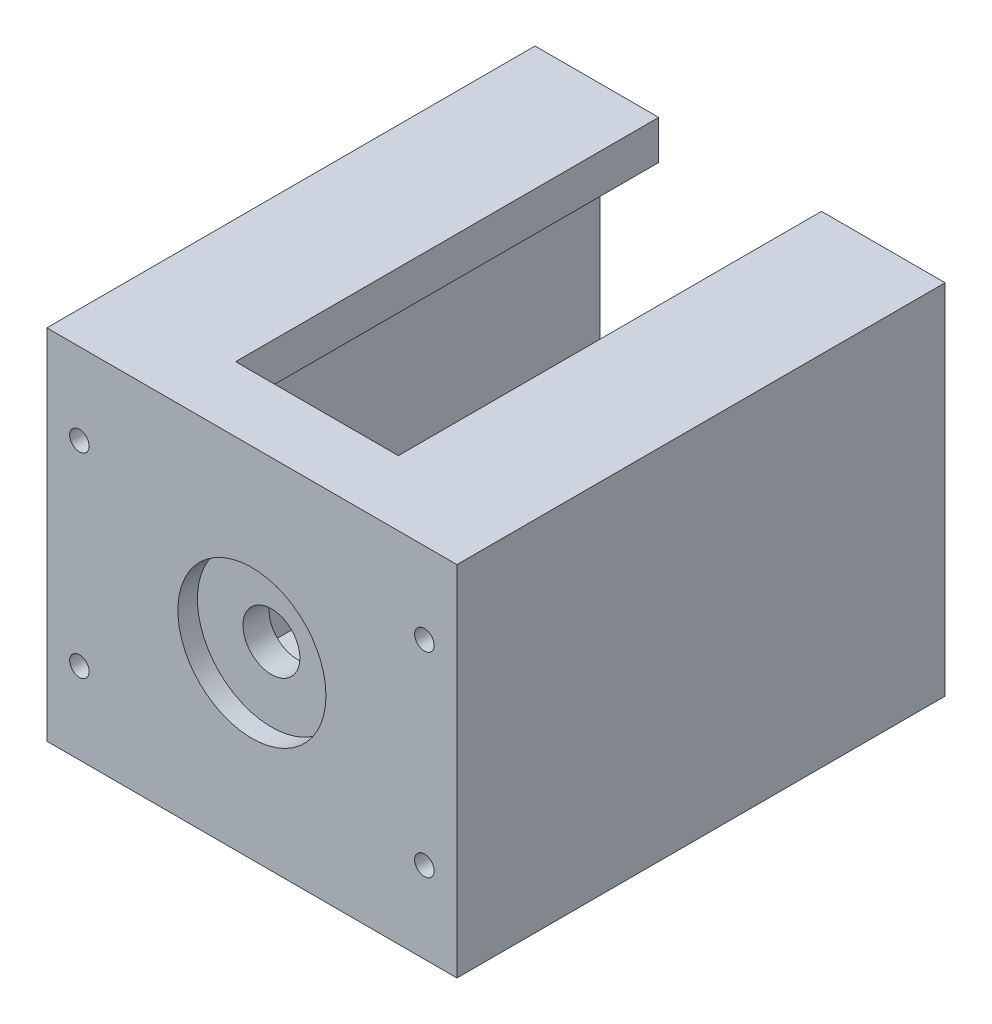
ISO-10303-21;
HEADER;
FILE_DESCRIPTION(('STEP AP214'),'2;1');
FILE_NAME('part.step','',(''),(''),'','','');
FILE_SCHEMA(('AUTOMOTIVE_DESIGN { 1 0 10303 214 1 1 1 1 }'));
ENDSEC;
DATA;
#1=APPLICATION_CONTEXT('core data for automotive mechanical design processes');
#2=APPLICATION_PROTOCOL_DEFINITION('international standard','automotive_design',2000,#1);
#3=PRODUCT_CONTEXT('',#1,'mechanical');
#4=PRODUCT('Part','Part','',(#3));
#5=PRODUCT_RELATED_PRODUCT_CATEGORY('part','',(#4));
#6=PRODUCT_DEFINITION_FORMATION('','',#4);
#7=PRODUCT_DEFINITION_CONTEXT('part definition',#1,'design');
#8=PRODUCT_DEFINITION('design','',#6,#7);
#9=PRODUCT_DEFINITION_SHAPE('','',#8);
#10=(LENGTH_UNIT() NAMED_UNIT(*) SI_UNIT(.MILLI.,.METRE.));
#11=(NAMED_UNIT(*) PLANE_ANGLE_UNIT() SI_UNIT($,.RADIAN.));
#12=(NAMED_UNIT(*) SI_UNIT($,.STERADIAN.) SOLID_ANGLE_UNIT());
#13=UNCERTAINTY_MEASURE_WITH_UNIT(LENGTH_MEASURE(1.E-05),#10,'distance_accuracy_value','');
#14=(GEOMETRIC_REPRESENTATION_CONTEXT(3) GLOBAL_UNCERTAINTY_ASSIGNED_CONTEXT((#13)) GLOBAL_UNIT_ASSIGNED_CONTEXT((#10,
#11,#12)) REPRESENTATION_CONTEXT('',''));
#15=CARTESIAN_POINT('',(0.,0.,0.));
#16=DIRECTION('',(0.,0.,1.));
#17=DIRECTION('',(1.,0.,0.));
#18=AXIS2_PLACEMENT_3D('',#15,#16,#17);
#19=CARTESIAN_POINT('',(0.,0.,0.));
#20=DIRECTION('',(0.,0.,1.));
#21=DIRECTION('',(1.,0.,0.));
#22=AXIS2_PLACEMENT_3D('',#19,#20,#21);
#23=PLANE('',#22);
#24=DIRECTION('',(0.,1.,0.));
#25=VECTOR('',#24,1.);
#26=CARTESIAN_POINT('',(43.,0.,0.));
#27=LINE('',#26,#25);
#28=CARTESIAN_POINT('',(43.,0.,0.));
#29=VERTEX_POINT('',#28);
#30=CARTESIAN_POINT('',(43.,43.,0.));
#31=VERTEX_POINT('',#30);
#32=EDGE_CURVE('E144',#29,#31,#27,.T.);
#33=ORIENTED_EDGE('',*,*,#32,.F.);
#34=DIRECTION('',(1.,0.,0.));
#35=VECTOR('',#34,1.);
#36=CARTESIAN_POINT('',(0.,0.,0.));
#37=LINE('',#36,#35);
#38=CARTESIAN_POINT('',(0.,0.,0.));
#39=VERTEX_POINT('',#38);
#40=EDGE_CURVE('E166',#39,#29,#37,.T.);
#41=ORIENTED_EDGE('',*,*,#40,.F.);
#42=DIRECTION('',(0.,1.,0.));
#43=VECTOR('',#42,1.);
#44=CARTESIAN_POINT('',(0.,0.,0.));
#45=LINE('',#44,#43);
#46=CARTESIAN_POINT('',(0.,43.,0.));
#47=VERTEX_POINT('',#46);
#48=EDGE_CURVE('E169',#39,#47,#45,.T.);
#49=ORIENTED_EDGE('',*,*,#48,.T.);
#50=DIRECTION('',(1.,0.,0.));
#51=VECTOR('',#50,1.);
#52=CARTESIAN_POINT('',(0.,43.,0.));
#53=LINE('',#52,#51);
#54=CARTESIAN_POINT('',(8.99999999999999,43.,0.));
#55=VERTEX_POINT('',#54);
#56=EDGE_CURVE('E171',#47,#55,#53,.T.);
#57=ORIENTED_EDGE('',*,*,#56,.T.);
#58=DIRECTION('',(0.,-1.,0.));
#59=VECTOR('',#58,1.);
#60=CARTESIAN_POINT('',(8.99999999999999,118.641941385921,0.));
#61=LINE('',#60,#59);
#62=CARTESIAN_POINT('',(8.99999999999999,49.,0.));
#63=VERTEX_POINT('',#62);
#64=EDGE_CURVE('E250',#63,#55,#61,.T.);
#65=ORIENTED_EDGE('',*,*,#64,.F.);
#66=DIRECTION('',(-1.,0.,0.));
#67=VECTOR('',#66,1.);
#68=CARTESIAN_POINT('',(0.,49.,0.));
#69=LINE('',#68,#67);
#70=CARTESIAN_POINT('',(34.,49.,0.));
#71=VERTEX_POINT('',#70);
#72=EDGE_CURVE('E143',#71,#63,#69,.T.);
#73=ORIENTED_EDGE('',*,*,#72,.F.);
#74=DIRECTION('',(0.,-1.,0.));
#75=VECTOR('',#74,1.);
#76=CARTESIAN_POINT('',(34.,118.641941385921,0.));
#77=LINE('',#76,#75);
#78=CARTESIAN_POINT('',(34.,43.,0.));
#79=VERTEX_POINT('',#78);
#80=EDGE_CURVE('E254',#71,#79,#77,.T.);
#81=ORIENTED_EDGE('',*,*,#80,.T.);
#82=EDGE_CURVE('E61',#79,#31,#53,.T.);
#83=ORIENTED_EDGE('',*,*,#82,.T.);
#84=EDGE_LOOP('',(#33,#41,#49,#57,#65,#73,#81,#83));
#85=FACE_BOUND('',#84,.T.);
#86=CARTESIAN_POINT('',(21.5,21.5,0.));
#87=DIRECTION('',(0.,0.,1.));
#88=DIRECTION('',(1.,0.,0.));
#89=AXIS2_PLACEMENT_3D('',#86,#87,#88);
#90=CIRCLE('',#89,11.375);
#91=CARTESIAN_POINT('',(32.875,21.5,0.));
#92=VERTEX_POINT('',#91);
#93=EDGE_CURVE('E265',#92,#92,#90,.T.);
#94=ORIENTED_EDGE('',*,*,#93,.T.);
#95=EDGE_LOOP('',(#94));
#96=FACE_BOUND('',#95,.T.);
#97=ADVANCED_FACE('F38',(#85,#96),#23,.F.);
#98=CARTESIAN_POINT('',(0.,43.,-65.));
#99=DIRECTION('',(0.,-1.,0.));
#100=DIRECTION('',(0.,0.,-1.));
#101=AXIS2_PLACEMENT_3D('',#98,#99,#100);
#102=PLANE('',#101);
#103=DIRECTION('',(1.,0.,0.));
#104=VECTOR('',#103,1.);
#105=CARTESIAN_POINT('',(0.,43.,-65.));
#106=LINE('',#105,#104);
#107=CARTESIAN_POINT('',(0.,43.,-65.));
#108=VERTEX_POINT('',#107);
#109=CARTESIAN_POINT('',(8.99999999999999,43.,-65.));
#110=VERTEX_POINT('',#109);
#111=EDGE_CURVE('E230',#108,#110,#106,.T.);
#112=ORIENTED_EDGE('',*,*,#111,.T.);
#113=DIRECTION('',(0.,0.,1.));
#114=VECTOR('',#113,1.);
#115=CARTESIAN_POINT('',(8.99999999999999,43.,0.));
#116=LINE('',#115,#114);
#117=EDGE_CURVE('E53',#110,#55,#116,.T.);
#118=ORIENTED_EDGE('',*,*,#117,.T.);
#119=ORIENTED_EDGE('',*,*,#56,.F.);
#120=DIRECTION('',(0.,0.,1.));
#121=VECTOR('',#120,1.);
#122=CARTESIAN_POINT('',(0.,43.,-65.));
#123=LINE('',#122,#121);
#124=EDGE_CURVE('E178',#108,#47,#123,.T.);
#125=ORIENTED_EDGE('',*,*,#124,.F.);
#126=EDGE_LOOP('',(#112,#118,#119,#125));
#127=FACE_BOUND('',#126,.T.);
#128=ADVANCED_FACE('F310',(#127),#102,.T.);
#129=CARTESIAN_POINT('',(0.,-6.00000000000001,10.));
#130=DIRECTION('',(0.,1.,0.));
#131=DIRECTION('',(-1.,0.,0.));
#132=AXIS2_PLACEMENT_3D('',#129,#130,#131);
#133=PLANE('',#132);
#134=DIRECTION('',(0.,0.,-1.));
#135=VECTOR('',#134,1.);
#136=CARTESIAN_POINT('',(-10.,-6.00000000000001,10.));
#137=LINE('',#136,#135);
#138=CARTESIAN_POINT('',(-10.,-6.00000000000001,10.));
#139=VERTEX_POINT('',#138);
#140=CARTESIAN_POINT('',(-10.,-6.00000000000001,-65.));
#141=VERTEX_POINT('',#140);
#142=EDGE_CURVE('E211',#139,#141,#137,.T.);
#143=ORIENTED_EDGE('',*,*,#142,.T.);
#144=DIRECTION('',(1.,0.,0.));
#145=VECTOR('',#144,1.);
#146=CARTESIAN_POINT('',(0.,-6.00000000000001,-65.));
#147=LINE('',#146,#145);
#148=CARTESIAN_POINT('',(53.,-6.,-65.));
#149=VERTEX_POINT('',#148);
#150=EDGE_CURVE('E226',#141,#149,#147,.T.);
#151=ORIENTED_EDGE('',*,*,#150,.T.);
#152=DIRECTION('',(0.,0.,-1.));
#153=VECTOR('',#152,1.);
#154=CARTESIAN_POINT('',(53.,-6.,10.));
#155=LINE('',#154,#153);
#156=CARTESIAN_POINT('',(53.,-6.,10.));
#157=VERTEX_POINT('',#156);
#158=EDGE_CURVE('E46',#157,#149,#155,.T.);
#159=ORIENTED_EDGE('',*,*,#158,.F.);
#160=DIRECTION('',(1.,0.,0.));
#161=VECTOR('',#160,1.);
#162=CARTESIAN_POINT('',(0.,-6.00000000000001,10.));
#163=LINE('',#162,#161);
#164=EDGE_CURVE('E194',#139,#157,#163,.T.);
#165=ORIENTED_EDGE('',*,*,#164,.F.);
#166=EDGE_LOOP('',(#143,#151,#159,#165));
#167=FACE_BOUND('',#166,.T.);
#168=ADVANCED_FACE('F229',(#167),#133,.F.);
#169=CARTESIAN_POINT('',(53.,0.,10.));
#170=DIRECTION('',(-1.,0.,0.));
#171=DIRECTION('',(0.,-1.,0.));
#172=AXIS2_PLACEMENT_3D('',#169,#170,#171);
#173=PLANE('',#172);
#174=ORIENTED_EDGE('',*,*,#158,.T.);
#175=DIRECTION('',(0.,1.,0.));
#176=VECTOR('',#175,1.);
#177=CARTESIAN_POINT('',(53.,0.,-65.));
#178=LINE('',#177,#176);
#179=CARTESIAN_POINT('',(53.,49.,-65.));
#180=VERTEX_POINT('',#179);
#181=EDGE_CURVE('E157',#149,#180,#178,.T.);
#182=ORIENTED_EDGE('',*,*,#181,.T.);
#183=DIRECTION('',(0.,0.,-1.));
#184=VECTOR('',#183,1.);
#185=CARTESIAN_POINT('',(53.,49.,10.));
#186=LINE('',#185,#184);
#187=CARTESIAN_POINT('',(53.,49.,10.));
#188=VERTEX_POINT('',#187);
#189=EDGE_CURVE('E215',#188,#180,#186,.T.);
#190=ORIENTED_EDGE('',*,*,#189,.F.);
#191=DIRECTION('',(0.,1.,0.));
#192=VECTOR('',#191,1.);
#193=CARTESIAN_POINT('',(53.,0.,10.));
#194=LINE('',#193,#192);
#195=EDGE_CURVE('E197',#157,#188,#194,.T.);
#196=ORIENTED_EDGE('',*,*,#195,.F.);
#197=EDGE_LOOP('',(#174,#182,#190,#196));
#198=FACE_BOUND('',#197,.T.);
#199=ADVANCED_FACE('F221',(#198),#173,.F.);
#200=CARTESIAN_POINT('',(0.,49.,10.));
#201=DIRECTION('',(0.,1.,0.));
#202=DIRECTION('',(-1.,0.,0.));
#203=AXIS2_PLACEMENT_3D('',#200,#201,#202);
#204=PLANE('',#203);
#205=DIRECTION('',(0.,0.,1.));
#206=VECTOR('',#205,1.);
#207=CARTESIAN_POINT('',(34.,49.,0.));
#208=LINE('',#207,#206);
#209=CARTESIAN_POINT('',(34.,49.,-65.));
#210=VERTEX_POINT('',#209);
#211=EDGE_CURVE('E251',#210,#71,#208,.T.);
#212=ORIENTED_EDGE('',*,*,#211,.T.);
#213=ORIENTED_EDGE('',*,*,#72,.T.);
#214=DIRECTION('',(0.,0.,1.));
#215=VECTOR('',#214,1.);
#216=CARTESIAN_POINT('',(8.99999999999999,49.,0.));
#217=LINE('',#216,#215);
#218=CARTESIAN_POINT('',(8.99999999999999,49.,-65.));
#219=VERTEX_POINT('',#218);
#220=EDGE_CURVE('E128',#219,#63,#217,.T.);
#221=ORIENTED_EDGE('',*,*,#220,.F.);
#222=DIRECTION('',(1.,0.,0.));
#223=VECTOR('',#222,1.);
#224=CARTESIAN_POINT('',(0.,49.,-65.));
#225=LINE('',#224,#223);
#226=CARTESIAN_POINT('',(-10.,49.,-65.));
#227=VERTEX_POINT('',#226);
#228=EDGE_CURVE('E140',#227,#219,#225,.T.);
#229=ORIENTED_EDGE('',*,*,#228,.F.);
#230=DIRECTION('',(0.,0.,-1.));
#231=VECTOR('',#230,1.);
#232=CARTESIAN_POINT('',(-10.,49.,10.));
#233=LINE('',#232,#231);
#234=CARTESIAN_POINT('',(-10.,49.,10.));
#235=VERTEX_POINT('',#234);
#236=EDGE_CURVE('E213',#235,#227,#233,.T.);
#237=ORIENTED_EDGE('',*,*,#236,.F.);
#238=DIRECTION('',(1.,0.,0.));
#239=VECTOR('',#238,1.);
#240=CARTESIAN_POINT('',(0.,49.,10.));
#241=LINE('',#240,#239);
#242=EDGE_CURVE('E199',#235,#188,#241,.T.);
#243=ORIENTED_EDGE('',*,*,#242,.T.);
#244=ORIENTED_EDGE('',*,*,#189,.T.);
#245=EDGE_CURVE('E153',#210,#180,#225,.T.);
#246=ORIENTED_EDGE('',*,*,#245,.F.);
#247=EDGE_LOOP('',(#212,#213,#221,#229,#237,#243,#244,#246));
#248=FACE_BOUND('',#247,.T.);
#249=ADVANCED_FACE('F139',(#248),#204,.T.);
#250=CARTESIAN_POINT('',(48.,36.5,10.));
#251=DIRECTION('',(0.,0.,-1.));
#252=DIRECTION('',(-1.,0.,0.));
#253=AXIS2_PLACEMENT_3D('',#250,#251,#252);
#254=CYLINDRICAL_SURFACE('',#253,1.50000000000001);
#255=CARTESIAN_POINT('',(48.,36.5,10.));
#256=DIRECTION('',(0.,0.,1.));
#257=DIRECTION('',(1.,0.,0.));
#258=AXIS2_PLACEMENT_3D('',#255,#256,#257);
#259=CIRCLE('',#258,1.50000000000001);
#260=CARTESIAN_POINT('',(49.5,36.5,10.));
#261=VERTEX_POINT('',#260);
#262=EDGE_CURVE('E205',#261,#261,#259,.F.);
#263=ORIENTED_EDGE('',*,*,#262,.F.);
#264=EDGE_LOOP('',(#263));
#265=FACE_BOUND('',#264,.T.);
#266=CARTESIAN_POINT('',(48.,36.5,-65.));
#267=DIRECTION('',(0.,0.,1.));
#268=DIRECTION('',(1.,0.,0.));
#269=AXIS2_PLACEMENT_3D('',#266,#267,#268);
#270=CIRCLE('',#269,1.50000000000001);
#271=CARTESIAN_POINT('',(49.5,36.5,-65.));
#272=VERTEX_POINT('',#271);
#273=EDGE_CURVE('E155',#272,#272,#270,.F.);
#274=ORIENTED_EDGE('',*,*,#273,.T.);
#275=EDGE_LOOP('',(#274));
#276=FACE_BOUND('',#275,.T.);
#277=ADVANCED_FACE('F318',(#265,#276),#254,.F.);
#278=CARTESIAN_POINT('',(-10.,0.,10.));
#279=DIRECTION('',(-1.,0.,0.));
#280=DIRECTION('',(0.,-1.,0.));
#281=AXIS2_PLACEMENT_3D('',#278,#279,#280);
#282=PLANE('',#281);
#283=ORIENTED_EDGE('',*,*,#236,.T.);
#284=DIRECTION('',(0.,1.,0.));
#285=VECTOR('',#284,1.);
#286=CARTESIAN_POINT('',(-10.,0.,-65.));
#287=LINE('',#286,#285);
#288=EDGE_CURVE('E152',#141,#227,#287,.T.);
#289=ORIENTED_EDGE('',*,*,#288,.F.);
#290=ORIENTED_EDGE('',*,*,#142,.F.);
#291=DIRECTION('',(0.,1.,0.));
#292=VECTOR('',#291,1.);
#293=CARTESIAN_POINT('',(-10.,0.,10.));
#294=LINE('',#293,#292);
#295=EDGE_CURVE('E202',#139,#235,#294,.T.);
#296=ORIENTED_EDGE('',*,*,#295,.T.);
#297=EDGE_LOOP('',(#283,#289,#290,#296));
#298=FACE_BOUND('',#297,.T.);
#299=ADVANCED_FACE('F321',(#298),#282,.T.);
#300=CARTESIAN_POINT('',(-5.,36.5,10.));
#301=DIRECTION('',(0.,0.,-1.));
#302=DIRECTION('',(-1.,0.,0.));
#303=AXIS2_PLACEMENT_3D('',#300,#301,#302);
#304=CYLINDRICAL_SURFACE('',#303,1.5);
#305=CARTESIAN_POINT('',(-5.,36.5,10.));
#306=DIRECTION('',(0.,0.,1.));
#307=DIRECTION('',(1.,0.,0.));
#308=AXIS2_PLACEMENT_3D('',#305,#306,#307);
#309=CIRCLE('',#308,1.5);
#310=CARTESIAN_POINT('',(-3.5,36.5,10.));
#311=VERTEX_POINT('',#310);
#312=EDGE_CURVE('E191',#311,#311,#309,.T.);
#313=ORIENTED_EDGE('',*,*,#312,.T.);
#314=EDGE_LOOP('',(#313));
#315=FACE_BOUND('',#314,.T.);
#316=CARTESIAN_POINT('',(-5.,36.5,-65.));
#317=DIRECTION('',(0.,0.,1.));
#318=DIRECTION('',(1.,0.,0.));
#319=AXIS2_PLACEMENT_3D('',#316,#317,#318);
#320=CIRCLE('',#319,1.5);
#321=CARTESIAN_POINT('',(-3.5,36.5,-65.));
#322=VERTEX_POINT('',#321);
#323=EDGE_CURVE('E242',#322,#322,#320,.T.);
#324=ORIENTED_EDGE('',*,*,#323,.F.);
#325=EDGE_LOOP('',(#324));
#326=FACE_BOUND('',#325,.T.);
#327=ADVANCED_FACE('F325',(#315,#326),#304,.F.);
#328=CARTESIAN_POINT('',(-5.,6.49999999999999,10.));
#329=DIRECTION('',(0.,0.,-1.));
#330=DIRECTION('',(-1.,0.,0.));
#331=AXIS2_PLACEMENT_3D('',#328,#329,#330);
#332=CYLINDRICAL_SURFACE('',#331,1.5);
#333=CARTESIAN_POINT('',(-5.,6.49999999999999,10.));
#334=DIRECTION('',(0.,0.,1.));
#335=DIRECTION('',(1.,0.,0.));
#336=AXIS2_PLACEMENT_3D('',#333,#334,#335);
#337=CIRCLE('',#336,1.5);
#338=CARTESIAN_POINT('',(-3.5,6.49999999999999,10.));
#339=VERTEX_POINT('',#338);
#340=EDGE_CURVE('E188',#339,#339,#337,.T.);
#341=ORIENTED_EDGE('',*,*,#340,.T.);
#342=EDGE_LOOP('',(#341));
#343=FACE_BOUND('',#342,.T.);
#344=CARTESIAN_POINT('',(-5.,6.49999999999999,-65.));
#345=DIRECTION('',(0.,0.,1.));
#346=DIRECTION('',(1.,0.,0.));
#347=AXIS2_PLACEMENT_3D('',#344,#345,#346);
#348=CIRCLE('',#347,1.5);
#349=CARTESIAN_POINT('',(-3.5,6.49999999999999,-65.));
#350=VERTEX_POINT('',#349);
#351=EDGE_CURVE('E245',#350,#350,#348,.T.);
#352=ORIENTED_EDGE('',*,*,#351,.F.);
#353=EDGE_LOOP('',(#352));
#354=FACE_BOUND('',#353,.T.);
#355=ADVANCED_FACE('F334',(#343,#354),#332,.F.);
#356=CARTESIAN_POINT('',(48.,6.49999999999999,10.));
#357=DIRECTION('',(0.,0.,-1.));
#358=DIRECTION('',(-1.,0.,0.));
#359=AXIS2_PLACEMENT_3D('',#356,#357,#358);
#360=CYLINDRICAL_SURFACE('',#359,1.5);
#361=CARTESIAN_POINT('',(48.,6.49999999999999,10.));
#362=DIRECTION('',(0.,0.,1.));
#363=DIRECTION('',(1.,0.,0.));
#364=AXIS2_PLACEMENT_3D('',#361,#362,#363);
#365=CIRCLE('',#364,1.5);
#366=CARTESIAN_POINT('',(49.5,6.49999999999999,10.));
#367=VERTEX_POINT('',#366);
#368=EDGE_CURVE('E177',#367,#367,#365,.F.);
#369=ORIENTED_EDGE('',*,*,#368,.F.);
#370=EDGE_LOOP('',(#369));
#371=FACE_BOUND('',#370,.T.);
#372=CARTESIAN_POINT('',(48.,6.49999999999999,-65.));
#373=DIRECTION('',(0.,0.,1.));
#374=DIRECTION('',(1.,0.,0.));
#375=AXIS2_PLACEMENT_3D('',#372,#373,#374);
#376=CIRCLE('',#375,1.5);
#377=CARTESIAN_POINT('',(49.5,6.49999999999999,-65.));
#378=VERTEX_POINT('',#377);
#379=EDGE_CURVE('E174',#378,#378,#376,.F.);
#380=ORIENTED_EDGE('',*,*,#379,.T.);
#381=EDGE_LOOP('',(#380));
#382=FACE_BOUND('',#381,.T.);
#383=ADVANCED_FACE('F40',(#371,#382),#360,.F.);
#384=CARTESIAN_POINT('',(21.5,21.5,10.));
#385=DIRECTION('',(0.,0.,-1.));
#386=DIRECTION('',(-1.,0.,0.));
#387=AXIS2_PLACEMENT_3D('',#384,#385,#386);
#388=CYLINDRICAL_SURFACE('',#387,11.375);
#389=CARTESIAN_POINT('',(21.5,21.5,7.));
#390=DIRECTION('',(0.,0.,1.));
#391=DIRECTION('',(1.,0.,0.));
#392=AXIS2_PLACEMENT_3D('',#389,#390,#391);
#393=CIRCLE('',#392,11.375);
#394=CARTESIAN_POINT('',(32.875,21.5,7.));
#395=VERTEX_POINT('',#394);
#396=EDGE_CURVE('E12',#395,#395,#393,.T.);
#397=ORIENTED_EDGE('',*,*,#396,.F.);
#398=EDGE_LOOP('',(#397));
#399=FACE_BOUND('',#398,.T.);
#400=CARTESIAN_POINT('',(21.5,21.5,10.));
#401=DIRECTION('',(0.,0.,1.));
#402=DIRECTION('',(1.,0.,0.));
#403=AXIS2_PLACEMENT_3D('',#400,#401,#402);
#404=CIRCLE('',#403,11.375);
#405=CARTESIAN_POINT('',(32.875,21.5,10.));
#406=VERTEX_POINT('',#405);
#407=EDGE_CURVE('E208',#406,#406,#404,.T.);
#408=ORIENTED_EDGE('',*,*,#407,.T.);
#409=EDGE_LOOP('',(#408));
#410=FACE_BOUND('',#409,.T.);
#411=ADVANCED_FACE('F290',(#399,#410),#388,.F.);
#412=CARTESIAN_POINT('',(0.,0.,10.));
#413=DIRECTION('',(0.,0.,1.));
#414=DIRECTION('',(1.,0.,0.));
#415=AXIS2_PLACEMENT_3D('',#412,#413,#414);
#416=PLANE('',#415);
#417=ORIENTED_EDGE('',*,*,#368,.T.);
#418=EDGE_LOOP('',(#417));
#419=FACE_BOUND('',#418,.T.);
#420=ORIENTED_EDGE('',*,*,#340,.F.);
#421=EDGE_LOOP('',(#420));
#422=FACE_BOUND('',#421,.T.);
#423=ORIENTED_EDGE('',*,*,#312,.F.);
#424=EDGE_LOOP('',(#423));
#425=FACE_BOUND('',#424,.T.);
#426=ORIENTED_EDGE('',*,*,#164,.T.);
#427=ORIENTED_EDGE('',*,*,#195,.T.);
#428=ORIENTED_EDGE('',*,*,#242,.F.);
#429=ORIENTED_EDGE('',*,*,#295,.F.);
#430=EDGE_LOOP('',(#426,#427,#428,#429));
#431=FACE_BOUND('',#430,.T.);
#432=ORIENTED_EDGE('',*,*,#262,.T.);
#433=EDGE_LOOP('',(#432));
#434=FACE_BOUND('',#433,.T.);
#435=ORIENTED_EDGE('',*,*,#407,.F.);
#436=EDGE_LOOP('',(#435));
#437=FACE_BOUND('',#436,.T.);
#438=ADVANCED_FACE('F293',(#419,#422,#425,#431,#434,#437),#416,.T.);
#439=CARTESIAN_POINT('',(43.,0.,-65.));
#440=DIRECTION('',(1.,0.,0.));
#441=DIRECTION('',(0.,0.,-1.));
#442=AXIS2_PLACEMENT_3D('',#439,#440,#441);
#443=PLANE('',#442);
#444=ORIENTED_EDGE('',*,*,#32,.T.);
#445=DIRECTION('',(0.,0.,1.));
#446=VECTOR('',#445,1.);
#447=CARTESIAN_POINT('',(43.,43.,-65.));
#448=LINE('',#447,#446);
#449=CARTESIAN_POINT('',(43.,43.,-65.));
#450=VERTEX_POINT('',#449);
#451=EDGE_CURVE('E175',#450,#31,#448,.T.);
#452=ORIENTED_EDGE('',*,*,#451,.F.);
#453=DIRECTION('',(0.,1.,0.));
#454=VECTOR('',#453,1.);
#455=CARTESIAN_POINT('',(43.,0.,-65.));
#456=LINE('',#455,#454);
#457=CARTESIAN_POINT('',(43.,0.,-65.));
#458=VERTEX_POINT('',#457);
#459=EDGE_CURVE('E239',#458,#450,#456,.T.);
#460=ORIENTED_EDGE('',*,*,#459,.F.);
#461=DIRECTION('',(0.,0.,1.));
#462=VECTOR('',#461,1.);
#463=CARTESIAN_POINT('',(43.,0.,-65.));
#464=LINE('',#463,#462);
#465=EDGE_CURVE('E163',#458,#29,#464,.T.);
#466=ORIENTED_EDGE('',*,*,#465,.T.);
#467=EDGE_LOOP('',(#444,#452,#460,#466));
#468=FACE_BOUND('',#467,.T.);
#469=ADVANCED_FACE('F298',(#468),#443,.F.);
#470=DIRECTION('',(0.,0.,1.));
#471=VECTOR('',#470,1.);
#472=CARTESIAN_POINT('',(34.,43.,0.));
#473=LINE('',#472,#471);
#474=CARTESIAN_POINT('',(34.,43.,-65.));
#475=VERTEX_POINT('',#474);
#476=EDGE_CURVE('E145',#475,#79,#473,.T.);
#477=ORIENTED_EDGE('',*,*,#476,.F.);
#478=EDGE_CURVE('E231',#475,#450,#106,.T.);
#479=ORIENTED_EDGE('',*,*,#478,.T.);
#480=ORIENTED_EDGE('',*,*,#451,.T.);
#481=ORIENTED_EDGE('',*,*,#82,.F.);
#482=EDGE_LOOP('',(#477,#479,#480,#481));
#483=FACE_BOUND('',#482,.T.);
#484=ADVANCED_FACE('F304',(#483),#102,.T.);
#485=CARTESIAN_POINT('',(0.,0.,-65.));
#486=DIRECTION('',(1.,0.,0.));
#487=DIRECTION('',(0.,0.,-1.));
#488=AXIS2_PLACEMENT_3D('',#485,#486,#487);
#489=PLANE('',#488);
#490=ORIENTED_EDGE('',*,*,#48,.F.);
#491=DIRECTION('',(0.,0.,1.));
#492=VECTOR('',#491,1.);
#493=CARTESIAN_POINT('',(0.,0.,-65.));
#494=LINE('',#493,#492);
#495=CARTESIAN_POINT('',(0.,0.,-65.));
#496=VERTEX_POINT('',#495);
#497=EDGE_CURVE('E181',#496,#39,#494,.T.);
#498=ORIENTED_EDGE('',*,*,#497,.F.);
#499=DIRECTION('',(0.,1.,0.));
#500=VECTOR('',#499,1.);
#501=CARTESIAN_POINT('',(0.,0.,-65.));
#502=LINE('',#501,#500);
#503=EDGE_CURVE('E234',#496,#108,#502,.T.);
#504=ORIENTED_EDGE('',*,*,#503,.T.);
#505=ORIENTED_EDGE('',*,*,#124,.T.);
#506=EDGE_LOOP('',(#490,#498,#504,#505));
#507=FACE_BOUND('',#506,.T.);
#508=ADVANCED_FACE('F360',(#507),#489,.T.);
#509=CARTESIAN_POINT('',(0.,0.,-65.));
#510=DIRECTION('',(0.,-1.,0.));
#511=DIRECTION('',(0.,0.,-1.));
#512=AXIS2_PLACEMENT_3D('',#509,#510,#511);
#513=PLANE('',#512);
#514=ORIENTED_EDGE('',*,*,#40,.T.);
#515=ORIENTED_EDGE('',*,*,#465,.F.);
#516=DIRECTION('',(1.,0.,0.));
#517=VECTOR('',#516,1.);
#518=CARTESIAN_POINT('',(0.,0.,-65.));
#519=LINE('',#518,#517);
#520=EDGE_CURVE('E237',#496,#458,#519,.T.);
#521=ORIENTED_EDGE('',*,*,#520,.F.);
#522=ORIENTED_EDGE('',*,*,#497,.T.);
#523=EDGE_LOOP('',(#514,#515,#521,#522));
#524=FACE_BOUND('',#523,.T.);
#525=ADVANCED_FACE('F349',(#524),#513,.F.);
#526=CARTESIAN_POINT('',(0.,0.,-65.));
#527=DIRECTION('',(0.,0.,1.));
#528=DIRECTION('',(1.,0.,0.));
#529=AXIS2_PLACEMENT_3D('',#526,#527,#528);
#530=PLANE('',#529);
#531=ORIENTED_EDGE('',*,*,#379,.F.);
#532=EDGE_LOOP('',(#531));
#533=FACE_BOUND('',#532,.T.);
#534=ORIENTED_EDGE('',*,*,#351,.T.);
#535=EDGE_LOOP('',(#534));
#536=FACE_BOUND('',#535,.T.);
#537=ORIENTED_EDGE('',*,*,#323,.T.);
#538=EDGE_LOOP('',(#537));
#539=FACE_BOUND('',#538,.T.);
#540=ORIENTED_EDGE('',*,*,#478,.F.);
#541=DIRECTION('',(0.,-1.,0.));
#542=VECTOR('',#541,1.);
#543=CARTESIAN_POINT('',(34.,118.641941385921,-65.));
#544=LINE('',#543,#542);
#545=EDGE_CURVE('E134',#210,#475,#544,.T.);
#546=ORIENTED_EDGE('',*,*,#545,.F.);
#547=ORIENTED_EDGE('',*,*,#245,.T.);
#548=ORIENTED_EDGE('',*,*,#181,.F.);
#549=ORIENTED_EDGE('',*,*,#150,.F.);
#550=ORIENTED_EDGE('',*,*,#288,.T.);
#551=ORIENTED_EDGE('',*,*,#228,.T.);
#552=DIRECTION('',(0.,-1.,0.));
#553=VECTOR('',#552,1.);
#554=CARTESIAN_POINT('',(8.99999999999999,118.641941385921,-65.));
#555=LINE('',#554,#553);
#556=EDGE_CURVE('E125',#219,#110,#555,.T.);
#557=ORIENTED_EDGE('',*,*,#556,.T.);
#558=ORIENTED_EDGE('',*,*,#111,.F.);
#559=ORIENTED_EDGE('',*,*,#503,.F.);
#560=ORIENTED_EDGE('',*,*,#520,.T.);
#561=ORIENTED_EDGE('',*,*,#459,.T.);
#562=EDGE_LOOP('',(#540,#546,#547,#548,#549,#550,#551,#557,#558,#559,#560,#561));
#563=FACE_BOUND('',#562,.T.);
#564=ORIENTED_EDGE('',*,*,#273,.F.);
#565=EDGE_LOOP('',(#564));
#566=FACE_BOUND('',#565,.T.);
#567=ADVANCED_FACE('F148',(#533,#536,#539,#563,#566),#530,.F.);
#568=CARTESIAN_POINT('',(34.,118.641941385921,0.));
#569=DIRECTION('',(1.,0.,0.));
#570=DIRECTION('',(0.,0.,-1.));
#571=AXIS2_PLACEMENT_3D('',#568,#569,#570);
#572=PLANE('',#571);
#573=ORIENTED_EDGE('',*,*,#545,.T.);
#574=ORIENTED_EDGE('',*,*,#476,.T.);
#575=ORIENTED_EDGE('',*,*,#80,.F.);
#576=ORIENTED_EDGE('',*,*,#211,.F.);
#577=EDGE_LOOP('',(#573,#574,#575,#576));
#578=FACE_BOUND('',#577,.T.);
#579=ADVANCED_FACE('F348',(#578),#572,.F.);
#580=CARTESIAN_POINT('',(8.99999999999999,118.641941385921,0.));
#581=DIRECTION('',(1.,0.,0.));
#582=DIRECTION('',(0.,0.,-1.));
#583=AXIS2_PLACEMENT_3D('',#580,#581,#582);
#584=PLANE('',#583);
#585=ORIENTED_EDGE('',*,*,#220,.T.);
#586=ORIENTED_EDGE('',*,*,#64,.T.);
#587=ORIENTED_EDGE('',*,*,#117,.F.);
#588=ORIENTED_EDGE('',*,*,#556,.F.);
#589=EDGE_LOOP('',(#585,#586,#587,#588));
#590=FACE_BOUND('',#589,.T.);
#591=ADVANCED_FACE('F127',(#590),#584,.T.);
#592=CARTESIAN_POINT('',(21.5,21.5,42.1733585439879));
#593=DIRECTION('',(0.,0.,-1.));
#594=DIRECTION('',(-1.,0.,0.));
#595=AXIS2_PLACEMENT_3D('',#592,#593,#594);
#596=CYLINDRICAL_SURFACE('',#595,4.375);
#597=CARTESIAN_POINT('',(21.5,21.5,3.));
#598=DIRECTION('',(0.,0.,1.));
#599=DIRECTION('',(1.,0.,0.));
#600=AXIS2_PLACEMENT_3D('',#597,#598,#599);
#601=CIRCLE('',#600,4.375);
#602=CARTESIAN_POINT('',(25.875,21.5,3.));
#603=VERTEX_POINT('',#602);
#604=EDGE_CURVE('E268',#603,#603,#601,.T.);
#605=ORIENTED_EDGE('',*,*,#604,.F.);
#606=EDGE_LOOP('',(#605));
#607=FACE_BOUND('',#606,.T.);
#608=CARTESIAN_POINT('',(21.5,21.5,7.));
#609=DIRECTION('',(0.,0.,1.));
#610=DIRECTION('',(1.,0.,0.));
#611=AXIS2_PLACEMENT_3D('',#608,#609,#610);
#612=CIRCLE('',#611,4.375);
#613=CARTESIAN_POINT('',(25.875,21.5,7.));
#614=VERTEX_POINT('',#613);
#615=EDGE_CURVE('E257',#614,#614,#612,.T.);
#616=ORIENTED_EDGE('',*,*,#615,.T.);
#617=EDGE_LOOP('',(#616));
#618=FACE_BOUND('',#617,.T.);
#619=ADVANCED_FACE('F277',(#607,#618),#596,.F.);
#620=CARTESIAN_POINT('',(0.,0.,7.));
#621=DIRECTION('',(0.,0.,1.));
#622=DIRECTION('',(1.,0.,0.));
#623=AXIS2_PLACEMENT_3D('',#620,#621,#622);
#624=PLANE('',#623);
#625=ORIENTED_EDGE('',*,*,#615,.F.);
#626=EDGE_LOOP('',(#625));
#627=FACE_BOUND('',#626,.T.);
#628=ORIENTED_EDGE('',*,*,#396,.T.);
#629=EDGE_LOOP('',(#628));
#630=FACE_BOUND('',#629,.T.);
#631=ADVANCED_FACE('F280',(#627,#630),#624,.T.);
#632=CARTESIAN_POINT('',(21.5,21.5,3.));
#633=DIRECTION('',(0.,0.,-1.));
#634=DIRECTION('',(-1.,0.,0.));
#635=AXIS2_PLACEMENT_3D('',#632,#633,#634);
#636=CYLINDRICAL_SURFACE('',#635,11.375);
#637=CARTESIAN_POINT('',(21.5,21.5,3.));
#638=DIRECTION('',(0.,0.,1.));
#639=DIRECTION('',(1.,0.,0.));
#640=AXIS2_PLACEMENT_3D('',#637,#638,#639);
#641=CIRCLE('',#640,11.375);
#642=CARTESIAN_POINT('',(32.875,21.5,3.));
#643=VERTEX_POINT('',#642);
#644=EDGE_CURVE('E264',#643,#643,#641,.T.);
#645=ORIENTED_EDGE('',*,*,#644,.T.);
#646=EDGE_LOOP('',(#645));
#647=FACE_BOUND('',#646,.T.);
#648=ORIENTED_EDGE('',*,*,#93,.F.);
#649=EDGE_LOOP('',(#648));
#650=FACE_BOUND('',#649,.T.);
#651=ADVANCED_FACE('F286',(#647,#650),#636,.F.);
#652=CARTESIAN_POINT('',(0.,0.,3.));
#653=DIRECTION('',(0.,0.,1.));
#654=DIRECTION('',(1.,0.,0.));
#655=AXIS2_PLACEMENT_3D('',#652,#653,#654);
#656=PLANE('',#655);
#657=ORIENTED_EDGE('',*,*,#604,.T.);
#658=EDGE_LOOP('',(#657));
#659=FACE_BOUND('',#658,.T.);
#660=ORIENTED_EDGE('',*,*,#644,.F.);
#661=EDGE_LOOP('',(#660));
#662=FACE_BOUND('',#661,.T.);
#663=ADVANCED_FACE('F274',(#659,#662),#656,.F.);
#664=CLOSED_SHELL('',(#97,#128,#168,#199,#249,#277,#299,#327,#355,#383,#411,#438,#469,#484,#508,
#525,#567,#579,#591,#619,#631,#651,#663));
#665=MANIFOLD_SOLID_BREP('B2',#664);
#666=ADVANCED_BREP_SHAPE_REPRESENTATION('',(#18,#665),#14);
#667=SHAPE_DEFINITION_REPRESENTATION(#9,#666);
ENDSEC;
END-ISO-10303-21;
